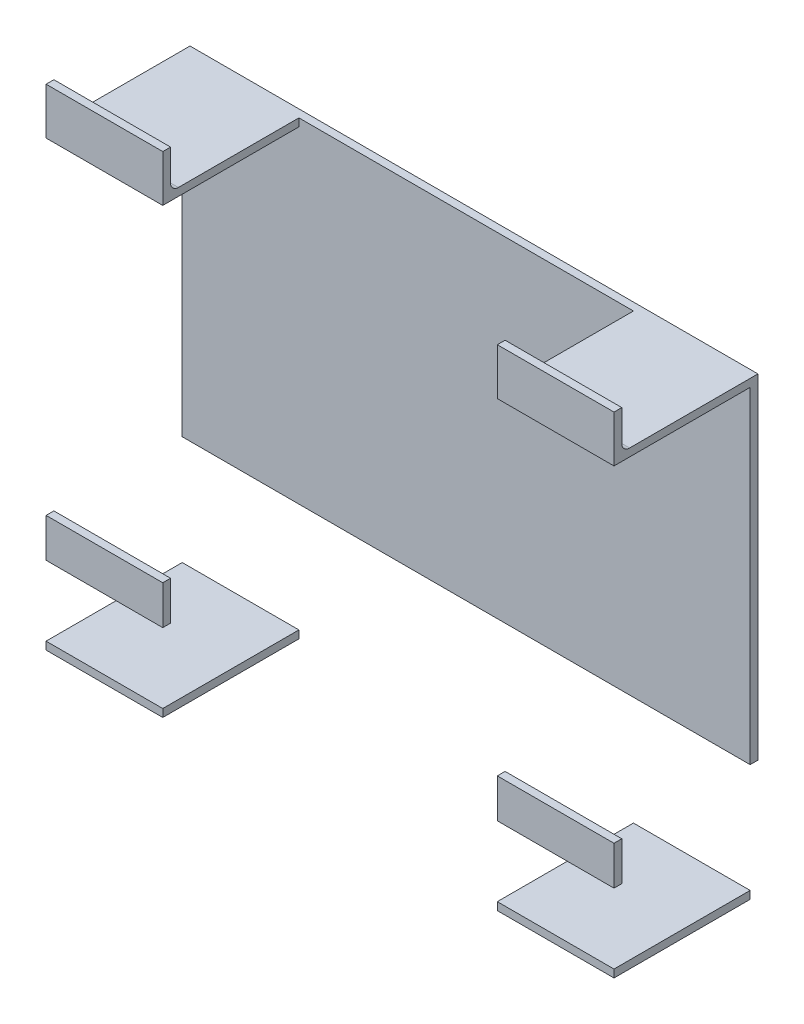
ISO-10303-21;
HEADER;
FILE_DESCRIPTION(('STEP AP214'),'2;1');
FILE_NAME('part.step','',(''),(''),'','','');
FILE_SCHEMA(('AUTOMOTIVE_DESIGN { 1 0 10303 214 1 1 1 1 }'));
ENDSEC;
DATA;
#1=APPLICATION_CONTEXT('core data for automotive mechanical design processes');
#2=APPLICATION_PROTOCOL_DEFINITION('international standard','automotive_design',2000,#1);
#3=PRODUCT_CONTEXT('',#1,'mechanical');
#4=PRODUCT('Part','Part','',(#3));
#5=PRODUCT_RELATED_PRODUCT_CATEGORY('part','',(#4));
#6=PRODUCT_DEFINITION_FORMATION('','',#4);
#7=PRODUCT_DEFINITION_CONTEXT('part definition',#1,'design');
#8=PRODUCT_DEFINITION('design','',#6,#7);
#9=PRODUCT_DEFINITION_SHAPE('','',#8);
#10=(LENGTH_UNIT() NAMED_UNIT(*) SI_UNIT(.MILLI.,.METRE.));
#11=(NAMED_UNIT(*) PLANE_ANGLE_UNIT() SI_UNIT($,.RADIAN.));
#12=(NAMED_UNIT(*) SI_UNIT($,.STERADIAN.) SOLID_ANGLE_UNIT());
#13=UNCERTAINTY_MEASURE_WITH_UNIT(LENGTH_MEASURE(1.E-05),#10,'distance_accuracy_value','');
#14=(GEOMETRIC_REPRESENTATION_CONTEXT(3) GLOBAL_UNCERTAINTY_ASSIGNED_CONTEXT((#13)) GLOBAL_UNIT_ASSIGNED_CONTEXT((#10,
#11,#12)) REPRESENTATION_CONTEXT('',''));
#15=CARTESIAN_POINT('',(0.,0.,0.));
#16=DIRECTION('',(0.,0.,1.));
#17=DIRECTION('',(1.,0.,0.));
#18=AXIS2_PLACEMENT_3D('',#15,#16,#17);
#19=CARTESIAN_POINT('',(43.,-38.,37.));
#20=DIRECTION('',(1.,0.,0.));
#21=DIRECTION('',(0.,0.,-1.));
#22=AXIS2_PLACEMENT_3D('',#19,#20,#21);
#23=PLANE('',#22);
#24=DIRECTION('',(0.,0.,-1.));
#25=VECTOR('',#24,1.);
#26=CARTESIAN_POINT('',(43.,-28.,37.));
#27=LINE('',#26,#25);
#28=CARTESIAN_POINT('',(43.,-28.,37.));
#29=VERTEX_POINT('',#28);
#30=CARTESIAN_POINT('',(43.,-28.,35.));
#31=VERTEX_POINT('',#30);
#32=EDGE_CURVE('E113',#29,#31,#27,.T.);
#33=ORIENTED_EDGE('',*,*,#32,.T.);
#34=DIRECTION('',(0.,1.,0.));
#35=VECTOR('',#34,1.);
#36=CARTESIAN_POINT('',(43.,-38.,35.));
#37=LINE('',#36,#35);
#38=CARTESIAN_POINT('',(43.,-38.,35.));
#39=VERTEX_POINT('',#38);
#40=EDGE_CURVE('E12',#39,#31,#37,.T.);
#41=ORIENTED_EDGE('',*,*,#40,.F.);
#42=DIRECTION('',(0.,0.,-1.));
#43=VECTOR('',#42,1.);
#44=CARTESIAN_POINT('',(43.,-38.,37.));
#45=LINE('',#44,#43);
#46=CARTESIAN_POINT('',(43.,-38.,37.));
#47=VERTEX_POINT('',#46);
#48=EDGE_CURVE('E101',#47,#39,#45,.T.);
#49=ORIENTED_EDGE('',*,*,#48,.F.);
#50=DIRECTION('',(0.,1.,0.));
#51=VECTOR('',#50,1.);
#52=CARTESIAN_POINT('',(43.,-38.,37.));
#53=LINE('',#52,#51);
#54=EDGE_CURVE('E109',#47,#29,#53,.T.);
#55=ORIENTED_EDGE('',*,*,#54,.T.);
#56=EDGE_LOOP('',(#33,#41,#49,#55));
#57=FACE_BOUND('',#56,.T.);
#58=ADVANCED_FACE('F50',(#57),#23,.F.);
#59=CARTESIAN_POINT('',(43.,-38.,35.));
#60=DIRECTION('',(0.,0.,1.));
#61=DIRECTION('',(1.,0.,0.));
#62=AXIS2_PLACEMENT_3D('',#59,#60,#61);
#63=PLANE('',#62);
#64=DIRECTION('',(1.,0.,0.));
#65=VECTOR('',#64,1.);
#66=CARTESIAN_POINT('',(43.,-28.,35.));
#67=LINE('',#66,#65);
#68=CARTESIAN_POINT('',(73.,-28.,35.));
#69=VERTEX_POINT('',#68);
#70=EDGE_CURVE('E105',#31,#69,#67,.T.);
#71=ORIENTED_EDGE('',*,*,#70,.T.);
#72=DIRECTION('',(0.,1.,0.));
#73=VECTOR('',#72,1.);
#74=CARTESIAN_POINT('',(73.,-38.,35.));
#75=LINE('',#74,#73);
#76=CARTESIAN_POINT('',(73.,-38.,35.));
#77=VERTEX_POINT('',#76);
#78=EDGE_CURVE('E58',#77,#69,#75,.T.);
#79=ORIENTED_EDGE('',*,*,#78,.F.);
#80=DIRECTION('',(1.,0.,0.));
#81=VECTOR('',#80,1.);
#82=CARTESIAN_POINT('',(43.,-38.,35.));
#83=LINE('',#82,#81);
#84=EDGE_CURVE('E96',#39,#77,#83,.T.);
#85=ORIENTED_EDGE('',*,*,#84,.F.);
#86=ORIENTED_EDGE('',*,*,#40,.T.);
#87=EDGE_LOOP('',(#71,#79,#85,#86));
#88=FACE_BOUND('',#87,.T.);
#89=ADVANCED_FACE('F104',(#88),#63,.F.);
#90=CARTESIAN_POINT('',(73.,-38.,37.));
#91=DIRECTION('',(-1.,0.,0.));
#92=DIRECTION('',(0.,0.,1.));
#93=AXIS2_PLACEMENT_3D('',#90,#91,#92);
#94=PLANE('',#93);
#95=DIRECTION('',(0.,0.,1.));
#96=VECTOR('',#95,1.);
#97=CARTESIAN_POINT('',(73.,-28.,37.));
#98=LINE('',#97,#96);
#99=CARTESIAN_POINT('',(73.,-28.,37.));
#100=VERTEX_POINT('',#99);
#101=EDGE_CURVE('E83',#69,#100,#98,.T.);
#102=ORIENTED_EDGE('',*,*,#101,.T.);
#103=DIRECTION('',(0.,1.,0.));
#104=VECTOR('',#103,1.);
#105=CARTESIAN_POINT('',(73.,-38.,37.));
#106=LINE('',#105,#104);
#107=CARTESIAN_POINT('',(73.,-38.,37.));
#108=VERTEX_POINT('',#107);
#109=EDGE_CURVE('E106',#108,#100,#106,.T.);
#110=ORIENTED_EDGE('',*,*,#109,.F.);
#111=DIRECTION('',(0.,0.,1.));
#112=VECTOR('',#111,1.);
#113=CARTESIAN_POINT('',(73.,-38.,37.));
#114=LINE('',#113,#112);
#115=EDGE_CURVE('E99',#77,#108,#114,.T.);
#116=ORIENTED_EDGE('',*,*,#115,.F.);
#117=ORIENTED_EDGE('',*,*,#78,.T.);
#118=EDGE_LOOP('',(#102,#110,#116,#117));
#119=FACE_BOUND('',#118,.T.);
#120=ADVANCED_FACE('F107',(#119),#94,.F.);
#121=CARTESIAN_POINT('',(43.,-38.,37.));
#122=DIRECTION('',(0.,0.,-1.));
#123=DIRECTION('',(-1.,0.,0.));
#124=AXIS2_PLACEMENT_3D('',#121,#122,#123);
#125=PLANE('',#124);
#126=DIRECTION('',(-1.,0.,0.));
#127=VECTOR('',#126,1.);
#128=CARTESIAN_POINT('',(43.,-28.,37.));
#129=LINE('',#128,#127);
#130=EDGE_CURVE('E89',#100,#29,#129,.T.);
#131=ORIENTED_EDGE('',*,*,#130,.T.);
#132=ORIENTED_EDGE('',*,*,#54,.F.);
#133=DIRECTION('',(-1.,0.,0.));
#134=VECTOR('',#133,1.);
#135=CARTESIAN_POINT('',(43.,-38.,37.));
#136=LINE('',#135,#134);
#137=EDGE_CURVE('E66',#108,#47,#136,.T.);
#138=ORIENTED_EDGE('',*,*,#137,.F.);
#139=ORIENTED_EDGE('',*,*,#109,.T.);
#140=EDGE_LOOP('',(#131,#132,#138,#139));
#141=FACE_BOUND('',#140,.T.);
#142=ADVANCED_FACE('F120',(#141),#125,.F.);
#143=CARTESIAN_POINT('',(0.,-38.,0.));
#144=DIRECTION('',(0.,-1.,0.));
#145=DIRECTION('',(0.,0.,-1.));
#146=AXIS2_PLACEMENT_3D('',#143,#144,#145);
#147=PLANE('',#146);
#148=ORIENTED_EDGE('',*,*,#48,.T.);
#149=ORIENTED_EDGE('',*,*,#84,.T.);
#150=ORIENTED_EDGE('',*,*,#115,.T.);
#151=ORIENTED_EDGE('',*,*,#137,.T.);
#152=EDGE_LOOP('',(#148,#149,#150,#151));
#153=FACE_BOUND('',#152,.T.);
#154=ADVANCED_FACE('F97',(#153),#147,.T.);
#155=CARTESIAN_POINT('',(0.,-28.,0.));
#156=DIRECTION('',(0.,-1.,0.));
#157=DIRECTION('',(0.,0.,-1.));
#158=AXIS2_PLACEMENT_3D('',#155,#156,#157);
#159=PLANE('',#158);
#160=ORIENTED_EDGE('',*,*,#32,.F.);
#161=ORIENTED_EDGE('',*,*,#130,.F.);
#162=ORIENTED_EDGE('',*,*,#101,.F.);
#163=ORIENTED_EDGE('',*,*,#70,.F.);
#164=EDGE_LOOP('',(#160,#161,#162,#163));
#165=FACE_BOUND('',#164,.T.);
#166=ADVANCED_FACE('F123',(#165),#159,.F.);
#167=CLOSED_SHELL('',(#58,#89,#120,#142,#154,#166));
#168=MANIFOLD_SOLID_BREP('B2',#167);
#169=CARTESIAN_POINT('',(-73.,-38.,37.));
#170=DIRECTION('',(1.,0.,0.));
#171=DIRECTION('',(0.,0.,-1.));
#172=AXIS2_PLACEMENT_3D('',#169,#170,#171);
#173=PLANE('',#172);
#174=DIRECTION('',(0.,0.,-1.));
#175=VECTOR('',#174,1.);
#176=CARTESIAN_POINT('',(-73.,-28.,37.));
#177=LINE('',#176,#175);
#178=CARTESIAN_POINT('',(-73.,-28.,37.));
#179=VERTEX_POINT('',#178);
#180=CARTESIAN_POINT('',(-73.,-28.,35.));
#181=VERTEX_POINT('',#180);
#182=EDGE_CURVE('E247',#179,#181,#177,.T.);
#183=ORIENTED_EDGE('',*,*,#182,.T.);
#184=DIRECTION('',(0.,1.,0.));
#185=VECTOR('',#184,1.);
#186=CARTESIAN_POINT('',(-73.,-38.,35.));
#187=LINE('',#186,#185);
#188=CARTESIAN_POINT('',(-73.,-38.,35.));
#189=VERTEX_POINT('',#188);
#190=EDGE_CURVE('E48',#189,#181,#187,.T.);
#191=ORIENTED_EDGE('',*,*,#190,.F.);
#192=DIRECTION('',(0.,0.,-1.));
#193=VECTOR('',#192,1.);
#194=CARTESIAN_POINT('',(-73.,-38.,37.));
#195=LINE('',#194,#193);
#196=CARTESIAN_POINT('',(-73.,-38.,37.));
#197=VERTEX_POINT('',#196);
#198=EDGE_CURVE('E235',#197,#189,#195,.T.);
#199=ORIENTED_EDGE('',*,*,#198,.F.);
#200=DIRECTION('',(0.,1.,0.));
#201=VECTOR('',#200,1.);
#202=CARTESIAN_POINT('',(-73.,-38.,37.));
#203=LINE('',#202,#201);
#204=EDGE_CURVE('E243',#197,#179,#203,.T.);
#205=ORIENTED_EDGE('',*,*,#204,.T.);
#206=EDGE_LOOP('',(#183,#191,#199,#205));
#207=FACE_BOUND('',#206,.T.);
#208=ADVANCED_FACE('F184',(#207),#173,.F.);
#209=CARTESIAN_POINT('',(-73.,-38.,35.));
#210=DIRECTION('',(0.,0.,1.));
#211=DIRECTION('',(1.,0.,0.));
#212=AXIS2_PLACEMENT_3D('',#209,#210,#211);
#213=PLANE('',#212);
#214=DIRECTION('',(1.,0.,0.));
#215=VECTOR('',#214,1.);
#216=CARTESIAN_POINT('',(-73.,-28.,35.));
#217=LINE('',#216,#215);
#218=CARTESIAN_POINT('',(-43.,-28.,35.));
#219=VERTEX_POINT('',#218);
#220=EDGE_CURVE('E239',#181,#219,#217,.T.);
#221=ORIENTED_EDGE('',*,*,#220,.T.);
#222=DIRECTION('',(0.,1.,0.));
#223=VECTOR('',#222,1.);
#224=CARTESIAN_POINT('',(-43.,-38.,35.));
#225=LINE('',#224,#223);
#226=CARTESIAN_POINT('',(-43.,-38.,35.));
#227=VERTEX_POINT('',#226);
#228=EDGE_CURVE('E192',#227,#219,#225,.T.);
#229=ORIENTED_EDGE('',*,*,#228,.F.);
#230=DIRECTION('',(1.,0.,0.));
#231=VECTOR('',#230,1.);
#232=CARTESIAN_POINT('',(-73.,-38.,35.));
#233=LINE('',#232,#231);
#234=EDGE_CURVE('E230',#189,#227,#233,.T.);
#235=ORIENTED_EDGE('',*,*,#234,.F.);
#236=ORIENTED_EDGE('',*,*,#190,.T.);
#237=EDGE_LOOP('',(#221,#229,#235,#236));
#238=FACE_BOUND('',#237,.T.);
#239=ADVANCED_FACE('F238',(#238),#213,.F.);
#240=CARTESIAN_POINT('',(-43.,-38.,37.));
#241=DIRECTION('',(-1.,0.,0.));
#242=DIRECTION('',(0.,0.,1.));
#243=AXIS2_PLACEMENT_3D('',#240,#241,#242);
#244=PLANE('',#243);
#245=DIRECTION('',(0.,0.,1.));
#246=VECTOR('',#245,1.);
#247=CARTESIAN_POINT('',(-43.,-28.,37.));
#248=LINE('',#247,#246);
#249=CARTESIAN_POINT('',(-43.,-28.,37.));
#250=VERTEX_POINT('',#249);
#251=EDGE_CURVE('E217',#219,#250,#248,.T.);
#252=ORIENTED_EDGE('',*,*,#251,.T.);
#253=DIRECTION('',(0.,1.,0.));
#254=VECTOR('',#253,1.);
#255=CARTESIAN_POINT('',(-43.,-38.,37.));
#256=LINE('',#255,#254);
#257=CARTESIAN_POINT('',(-43.,-38.,37.));
#258=VERTEX_POINT('',#257);
#259=EDGE_CURVE('E240',#258,#250,#256,.T.);
#260=ORIENTED_EDGE('',*,*,#259,.F.);
#261=DIRECTION('',(0.,0.,1.));
#262=VECTOR('',#261,1.);
#263=CARTESIAN_POINT('',(-43.,-38.,37.));
#264=LINE('',#263,#262);
#265=EDGE_CURVE('E233',#227,#258,#264,.T.);
#266=ORIENTED_EDGE('',*,*,#265,.F.);
#267=ORIENTED_EDGE('',*,*,#228,.T.);
#268=EDGE_LOOP('',(#252,#260,#266,#267));
#269=FACE_BOUND('',#268,.T.);
#270=ADVANCED_FACE('F241',(#269),#244,.F.);
#271=CARTESIAN_POINT('',(-73.,-38.,37.));
#272=DIRECTION('',(0.,0.,-1.));
#273=DIRECTION('',(-1.,0.,0.));
#274=AXIS2_PLACEMENT_3D('',#271,#272,#273);
#275=PLANE('',#274);
#276=DIRECTION('',(-1.,0.,0.));
#277=VECTOR('',#276,1.);
#278=CARTESIAN_POINT('',(-73.,-28.,37.));
#279=LINE('',#278,#277);
#280=EDGE_CURVE('E223',#250,#179,#279,.T.);
#281=ORIENTED_EDGE('',*,*,#280,.T.);
#282=ORIENTED_EDGE('',*,*,#204,.F.);
#283=DIRECTION('',(-1.,0.,0.));
#284=VECTOR('',#283,1.);
#285=CARTESIAN_POINT('',(-73.,-38.,37.));
#286=LINE('',#285,#284);
#287=EDGE_CURVE('E200',#258,#197,#286,.T.);
#288=ORIENTED_EDGE('',*,*,#287,.F.);
#289=ORIENTED_EDGE('',*,*,#259,.T.);
#290=EDGE_LOOP('',(#281,#282,#288,#289));
#291=FACE_BOUND('',#290,.T.);
#292=ADVANCED_FACE('F254',(#291),#275,.F.);
#293=CARTESIAN_POINT('',(0.,-38.,0.));
#294=DIRECTION('',(0.,-1.,0.));
#295=DIRECTION('',(0.,0.,-1.));
#296=AXIS2_PLACEMENT_3D('',#293,#294,#295);
#297=PLANE('',#296);
#298=ORIENTED_EDGE('',*,*,#198,.T.);
#299=ORIENTED_EDGE('',*,*,#234,.T.);
#300=ORIENTED_EDGE('',*,*,#265,.T.);
#301=ORIENTED_EDGE('',*,*,#287,.T.);
#302=EDGE_LOOP('',(#298,#299,#300,#301));
#303=FACE_BOUND('',#302,.T.);
#304=ADVANCED_FACE('F231',(#303),#297,.T.);
#305=CARTESIAN_POINT('',(0.,-28.,0.));
#306=DIRECTION('',(0.,-1.,0.));
#307=DIRECTION('',(0.,0.,-1.));
#308=AXIS2_PLACEMENT_3D('',#305,#306,#307);
#309=PLANE('',#308);
#310=ORIENTED_EDGE('',*,*,#182,.F.);
#311=ORIENTED_EDGE('',*,*,#280,.F.);
#312=ORIENTED_EDGE('',*,*,#251,.F.);
#313=ORIENTED_EDGE('',*,*,#220,.F.);
#314=EDGE_LOOP('',(#310,#311,#312,#313));
#315=FACE_BOUND('',#314,.T.);
#316=ADVANCED_FACE('F257',(#315),#309,.F.);
#317=CLOSED_SHELL('',(#208,#239,#270,#292,#304,#316));
#318=MANIFOLD_SOLID_BREP('B6',#317);
#319=CARTESIAN_POINT('',(73.0000000000001,-58.,37.));
#320=DIRECTION('',(-1.,0.,0.));
#321=DIRECTION('',(0.,0.,1.));
#322=AXIS2_PLACEMENT_3D('',#319,#320,#321);
#323=PLANE('',#322);
#324=DIRECTION('',(0.,1.,0.));
#325=VECTOR('',#324,1.);
#326=CARTESIAN_POINT('',(73.0000000000001,-58.,2.));
#327=LINE('',#326,#325);
#328=CARTESIAN_POINT('',(73.0000000000001,-58.,2.));
#329=VERTEX_POINT('',#328);
#330=CARTESIAN_POINT('',(73.0000000000001,-56.,2.));
#331=VERTEX_POINT('',#330);
#332=EDGE_CURVE('E182',#329,#331,#327,.T.);
#333=ORIENTED_EDGE('',*,*,#332,.T.);
#334=DIRECTION('',(0.,0.,-1.));
#335=VECTOR('',#334,1.);
#336=CARTESIAN_POINT('',(73.0000000000001,-56.,37.));
#337=LINE('',#336,#335);
#338=CARTESIAN_POINT('',(73.0000000000001,-56.,37.));
#339=VERTEX_POINT('',#338);
#340=EDGE_CURVE('E389',#339,#331,#337,.T.);
#341=ORIENTED_EDGE('',*,*,#340,.F.);
#342=DIRECTION('',(0.,1.,0.));
#343=VECTOR('',#342,1.);
#344=CARTESIAN_POINT('',(73.0000000000001,-58.,37.));
#345=LINE('',#344,#343);
#346=CARTESIAN_POINT('',(73.0000000000001,-58.,37.));
#347=VERTEX_POINT('',#346);
#348=EDGE_CURVE('E322',#347,#339,#345,.T.);
#349=ORIENTED_EDGE('',*,*,#348,.F.);
#350=DIRECTION('',(0.,0.,-1.));
#351=VECTOR('',#350,1.);
#352=CARTESIAN_POINT('',(73.0000000000001,-58.,37.));
#353=LINE('',#352,#351);
#354=EDGE_CURVE('E362',#347,#329,#353,.T.);
#355=ORIENTED_EDGE('',*,*,#354,.T.);
#356=EDGE_LOOP('',(#333,#341,#349,#355));
#357=FACE_BOUND('',#356,.T.);
#358=ADVANCED_FACE('F318',(#357),#323,.F.);
#359=CARTESIAN_POINT('',(73.0000000000001,-56.,37.));
#360=DIRECTION('',(0.,-1.,0.));
#361=DIRECTION('',(1.,0.,0.));
#362=AXIS2_PLACEMENT_3D('',#359,#360,#361);
#363=PLANE('',#362);
#364=DIRECTION('',(-1.,0.,0.));
#365=VECTOR('',#364,1.);
#366=CARTESIAN_POINT('',(73.0000000000001,-56.,2.));
#367=LINE('',#366,#365);
#368=CARTESIAN_POINT('',(43.,-56.,2.));
#369=VERTEX_POINT('',#368);
#370=EDGE_CURVE('E328',#331,#369,#367,.T.);
#371=ORIENTED_EDGE('',*,*,#370,.T.);
#372=DIRECTION('',(0.,0.,-1.));
#373=VECTOR('',#372,1.);
#374=CARTESIAN_POINT('',(43.,-56.,37.));
#375=LINE('',#374,#373);
#376=CARTESIAN_POINT('',(43.,-56.,37.));
#377=VERTEX_POINT('',#376);
#378=EDGE_CURVE('E376',#377,#369,#375,.T.);
#379=ORIENTED_EDGE('',*,*,#378,.F.);
#380=DIRECTION('',(-1.,0.,0.));
#381=VECTOR('',#380,1.);
#382=CARTESIAN_POINT('',(73.0000000000001,-56.,37.));
#383=LINE('',#382,#381);
#384=EDGE_CURVE('E354',#339,#377,#383,.T.);
#385=ORIENTED_EDGE('',*,*,#384,.F.);
#386=ORIENTED_EDGE('',*,*,#340,.T.);
#387=EDGE_LOOP('',(#371,#379,#385,#386));
#388=FACE_BOUND('',#387,.T.);
#389=ADVANCED_FACE('F392',(#388),#363,.F.);
#390=CARTESIAN_POINT('',(43.,-58.,37.));
#391=DIRECTION('',(-1.,0.,0.));
#392=DIRECTION('',(0.,0.,1.));
#393=AXIS2_PLACEMENT_3D('',#390,#391,#392);
#394=PLANE('',#393);
#395=DIRECTION('',(0.,1.,0.));
#396=VECTOR('',#395,1.);
#397=CARTESIAN_POINT('',(43.,-58.,2.));
#398=LINE('',#397,#396);
#399=CARTESIAN_POINT('',(43.,-58.,2.));
#400=VERTEX_POINT('',#399);
#401=EDGE_CURVE('E378',#400,#369,#398,.T.);
#402=ORIENTED_EDGE('',*,*,#401,.F.);
#403=DIRECTION('',(0.,0.,-1.));
#404=VECTOR('',#403,1.);
#405=CARTESIAN_POINT('',(43.,-58.,37.));
#406=LINE('',#405,#404);
#407=CARTESIAN_POINT('',(43.,-58.,37.));
#408=VERTEX_POINT('',#407);
#409=EDGE_CURVE('E367',#408,#400,#406,.T.);
#410=ORIENTED_EDGE('',*,*,#409,.F.);
#411=DIRECTION('',(0.,1.,0.));
#412=VECTOR('',#411,1.);
#413=CARTESIAN_POINT('',(43.,-58.,37.));
#414=LINE('',#413,#412);
#415=EDGE_CURVE('E387',#408,#377,#414,.T.);
#416=ORIENTED_EDGE('',*,*,#415,.T.);
#417=ORIENTED_EDGE('',*,*,#378,.T.);
#418=EDGE_LOOP('',(#402,#410,#416,#417));
#419=FACE_BOUND('',#418,.T.);
#420=ADVANCED_FACE('F379',(#419),#394,.T.);
#421=CARTESIAN_POINT('',(73.0000000000001,-58.,37.));
#422=DIRECTION('',(0.,-1.,0.));
#423=DIRECTION('',(0.,0.,-1.));
#424=AXIS2_PLACEMENT_3D('',#421,#422,#423);
#425=PLANE('',#424);
#426=DIRECTION('',(-1.,0.,0.));
#427=VECTOR('',#426,1.);
#428=CARTESIAN_POINT('',(73.0000000000001,-58.,2.));
#429=LINE('',#428,#427);
#430=EDGE_CURVE('E371',#329,#400,#429,.T.);
#431=ORIENTED_EDGE('',*,*,#430,.F.);
#432=ORIENTED_EDGE('',*,*,#354,.F.);
#433=DIRECTION('',(-1.,0.,0.));
#434=VECTOR('',#433,1.);
#435=CARTESIAN_POINT('',(73.0000000000001,-58.,37.));
#436=LINE('',#435,#434);
#437=EDGE_CURVE('E373',#347,#408,#436,.T.);
#438=ORIENTED_EDGE('',*,*,#437,.T.);
#439=ORIENTED_EDGE('',*,*,#409,.T.);
#440=EDGE_LOOP('',(#431,#432,#438,#439));
#441=FACE_BOUND('',#440,.T.);
#442=ADVANCED_FACE('F369',(#441),#425,.T.);
#443=CARTESIAN_POINT('',(0.,0.,37.));
#444=DIRECTION('',(0.,0.,1.));
#445=DIRECTION('',(1.,0.,0.));
#446=AXIS2_PLACEMENT_3D('',#443,#444,#445);
#447=PLANE('',#446);
#448=ORIENTED_EDGE('',*,*,#348,.T.);
#449=ORIENTED_EDGE('',*,*,#384,.T.);
#450=ORIENTED_EDGE('',*,*,#415,.F.);
#451=ORIENTED_EDGE('',*,*,#437,.F.);
#452=EDGE_LOOP('',(#448,#449,#450,#451));
#453=FACE_BOUND('',#452,.T.);
#454=ADVANCED_FACE('F320',(#453),#447,.T.);
#455=CARTESIAN_POINT('',(0.,0.,2.));
#456=DIRECTION('',(0.,0.,1.));
#457=DIRECTION('',(1.,0.,0.));
#458=AXIS2_PLACEMENT_3D('',#455,#456,#457);
#459=PLANE('',#458);
#460=ORIENTED_EDGE('',*,*,#332,.F.);
#461=ORIENTED_EDGE('',*,*,#430,.T.);
#462=ORIENTED_EDGE('',*,*,#401,.T.);
#463=ORIENTED_EDGE('',*,*,#370,.F.);
#464=EDGE_LOOP('',(#460,#461,#462,#463));
#465=FACE_BOUND('',#464,.T.);
#466=ADVANCED_FACE('F381',(#465),#459,.F.);
#467=CLOSED_SHELL('',(#358,#389,#420,#442,#454,#466));
#468=MANIFOLD_SOLID_BREP('B42',#467);
#469=CARTESIAN_POINT('',(-73.0000000000001,-58.,37.));
#470=DIRECTION('',(-1.,0.,0.));
#471=DIRECTION('',(0.,0.,1.));
#472=AXIS2_PLACEMENT_3D('',#469,#470,#471);
#473=PLANE('',#472);
#474=DIRECTION('',(0.,1.,0.));
#475=VECTOR('',#474,1.);
#476=CARTESIAN_POINT('',(-73.0000000000001,-58.,2.));
#477=LINE('',#476,#475);
#478=CARTESIAN_POINT('',(-73.0000000000001,-58.,2.));
#479=VERTEX_POINT('',#478);
#480=CARTESIAN_POINT('',(-73.0000000000001,-56.,2.));
#481=VERTEX_POINT('',#480);
#482=EDGE_CURVE('E316',#479,#481,#477,.T.);
#483=ORIENTED_EDGE('',*,*,#482,.F.);
#484=DIRECTION('',(0.,0.,-1.));
#485=VECTOR('',#484,1.);
#486=CARTESIAN_POINT('',(-73.0000000000001,-58.,37.));
#487=LINE('',#486,#485);
#488=CARTESIAN_POINT('',(-73.0000000000001,-58.,37.));
#489=VERTEX_POINT('',#488);
#490=EDGE_CURVE('E497',#489,#479,#487,.T.);
#491=ORIENTED_EDGE('',*,*,#490,.F.);
#492=DIRECTION('',(0.,1.,0.));
#493=VECTOR('',#492,1.);
#494=CARTESIAN_POINT('',(-73.0000000000001,-58.,37.));
#495=LINE('',#494,#493);
#496=CARTESIAN_POINT('',(-73.0000000000001,-56.,37.));
#497=VERTEX_POINT('',#496);
#498=EDGE_CURVE('E455',#489,#497,#495,.T.);
#499=ORIENTED_EDGE('',*,*,#498,.T.);
#500=DIRECTION('',(0.,0.,-1.));
#501=VECTOR('',#500,1.);
#502=CARTESIAN_POINT('',(-73.0000000000001,-56.,37.));
#503=LINE('',#502,#501);
#504=EDGE_CURVE('E470',#497,#481,#503,.T.);
#505=ORIENTED_EDGE('',*,*,#504,.T.);
#506=EDGE_LOOP('',(#483,#491,#499,#505));
#507=FACE_BOUND('',#506,.T.);
#508=ADVANCED_FACE('F451',(#507),#473,.T.);
#509=CARTESIAN_POINT('',(-73.0000000000001,-58.,37.));
#510=DIRECTION('',(0.,1.,0.));
#511=DIRECTION('',(0.,0.,1.));
#512=AXIS2_PLACEMENT_3D('',#509,#510,#511);
#513=PLANE('',#512);
#514=DIRECTION('',(1.,0.,0.));
#515=VECTOR('',#514,1.);
#516=CARTESIAN_POINT('',(-73.0000000000001,-58.,2.));
#517=LINE('',#516,#515);
#518=CARTESIAN_POINT('',(-43.,-58.,2.));
#519=VERTEX_POINT('',#518);
#520=EDGE_CURVE('E500',#479,#519,#517,.T.);
#521=ORIENTED_EDGE('',*,*,#520,.T.);
#522=DIRECTION('',(0.,0.,-1.));
#523=VECTOR('',#522,1.);
#524=CARTESIAN_POINT('',(-43.,-58.,37.));
#525=LINE('',#524,#523);
#526=CARTESIAN_POINT('',(-43.,-58.,37.));
#527=VERTEX_POINT('',#526);
#528=EDGE_CURVE('E503',#527,#519,#525,.T.);
#529=ORIENTED_EDGE('',*,*,#528,.F.);
#530=DIRECTION('',(1.,0.,0.));
#531=VECTOR('',#530,1.);
#532=CARTESIAN_POINT('',(-73.0000000000001,-58.,37.));
#533=LINE('',#532,#531);
#534=EDGE_CURVE('E519',#489,#527,#533,.T.);
#535=ORIENTED_EDGE('',*,*,#534,.F.);
#536=ORIENTED_EDGE('',*,*,#490,.T.);
#537=EDGE_LOOP('',(#521,#529,#535,#536));
#538=FACE_BOUND('',#537,.T.);
#539=ADVANCED_FACE('F502',(#538),#513,.F.);
#540=CARTESIAN_POINT('',(-43.,-58.,37.));
#541=DIRECTION('',(-1.,0.,0.));
#542=DIRECTION('',(0.,0.,1.));
#543=AXIS2_PLACEMENT_3D('',#540,#541,#542);
#544=PLANE('',#543);
#545=DIRECTION('',(0.,1.,0.));
#546=VECTOR('',#545,1.);
#547=CARTESIAN_POINT('',(-43.,-58.,2.));
#548=LINE('',#547,#546);
#549=CARTESIAN_POINT('',(-43.,-56.,2.));
#550=VERTEX_POINT('',#549);
#551=EDGE_CURVE('E506',#519,#550,#548,.T.);
#552=ORIENTED_EDGE('',*,*,#551,.T.);
#553=DIRECTION('',(0.,0.,-1.));
#554=VECTOR('',#553,1.);
#555=CARTESIAN_POINT('',(-43.,-56.,37.));
#556=LINE('',#555,#554);
#557=CARTESIAN_POINT('',(-43.,-56.,37.));
#558=VERTEX_POINT('',#557);
#559=EDGE_CURVE('E512',#558,#550,#556,.T.);
#560=ORIENTED_EDGE('',*,*,#559,.F.);
#561=DIRECTION('',(0.,1.,0.));
#562=VECTOR('',#561,1.);
#563=CARTESIAN_POINT('',(-43.,-58.,37.));
#564=LINE('',#563,#562);
#565=EDGE_CURVE('E487',#527,#558,#564,.T.);
#566=ORIENTED_EDGE('',*,*,#565,.F.);
#567=ORIENTED_EDGE('',*,*,#528,.T.);
#568=EDGE_LOOP('',(#552,#560,#566,#567));
#569=FACE_BOUND('',#568,.T.);
#570=ADVANCED_FACE('F510',(#569),#544,.F.);
#571=CARTESIAN_POINT('',(-73.0000000000001,-56.,37.));
#572=DIRECTION('',(0.,1.,0.));
#573=DIRECTION('',(-1.,0.,0.));
#574=AXIS2_PLACEMENT_3D('',#571,#572,#573);
#575=PLANE('',#574);
#576=DIRECTION('',(1.,0.,0.));
#577=VECTOR('',#576,1.);
#578=CARTESIAN_POINT('',(-73.0000000000001,-56.,2.));
#579=LINE('',#578,#577);
#580=EDGE_CURVE('E461',#481,#550,#579,.T.);
#581=ORIENTED_EDGE('',*,*,#580,.F.);
#582=ORIENTED_EDGE('',*,*,#504,.F.);
#583=DIRECTION('',(1.,0.,0.));
#584=VECTOR('',#583,1.);
#585=CARTESIAN_POINT('',(-73.0000000000001,-56.,37.));
#586=LINE('',#585,#584);
#587=EDGE_CURVE('E521',#497,#558,#586,.T.);
#588=ORIENTED_EDGE('',*,*,#587,.T.);
#589=ORIENTED_EDGE('',*,*,#559,.T.);
#590=EDGE_LOOP('',(#581,#582,#588,#589));
#591=FACE_BOUND('',#590,.T.);
#592=ADVANCED_FACE('F524',(#591),#575,.T.);
#593=CARTESIAN_POINT('',(0.,0.,37.));
#594=DIRECTION('',(0.,0.,-1.));
#595=DIRECTION('',(-1.,0.,0.));
#596=AXIS2_PLACEMENT_3D('',#593,#594,#595);
#597=PLANE('',#596);
#598=ORIENTED_EDGE('',*,*,#498,.F.);
#599=ORIENTED_EDGE('',*,*,#534,.T.);
#600=ORIENTED_EDGE('',*,*,#565,.T.);
#601=ORIENTED_EDGE('',*,*,#587,.F.);
#602=EDGE_LOOP('',(#598,#599,#600,#601));
#603=FACE_BOUND('',#602,.T.);
#604=ADVANCED_FACE('F453',(#603),#597,.F.);
#605=CARTESIAN_POINT('',(0.,0.,2.));
#606=DIRECTION('',(0.,0.,-1.));
#607=DIRECTION('',(-1.,0.,0.));
#608=AXIS2_PLACEMENT_3D('',#605,#606,#607);
#609=PLANE('',#608);
#610=ORIENTED_EDGE('',*,*,#482,.T.);
#611=ORIENTED_EDGE('',*,*,#580,.T.);
#612=ORIENTED_EDGE('',*,*,#551,.F.);
#613=ORIENTED_EDGE('',*,*,#520,.F.);
#614=EDGE_LOOP('',(#610,#611,#612,#613));
#615=FACE_BOUND('',#614,.T.);
#616=ADVANCED_FACE('F514',(#615),#609,.T.);
#617=CLOSED_SHELL('',(#508,#539,#570,#592,#604,#616));
#618=MANIFOLD_SOLID_BREP('B176',#617);
#619=CARTESIAN_POINT('',(0.,58.,2.));
#620=DIRECTION('',(0.,1.,0.));
#621=DIRECTION('',(0.,0.,1.));
#622=AXIS2_PLACEMENT_3D('',#619,#620,#621);
#623=PLANE('',#622);
#624=DIRECTION('',(0.,0.,-1.));
#625=VECTOR('',#624,1.);
#626=CARTESIAN_POINT('',(-73.,58.,2.));
#627=LINE('',#626,#625);
#628=CARTESIAN_POINT('',(-73.,58.,33.));
#629=VERTEX_POINT('',#628);
#630=CARTESIAN_POINT('',(-73.,58.,0.));
#631=VERTEX_POINT('',#630);
#632=EDGE_CURVE('E797',#629,#631,#627,.T.);
#633=ORIENTED_EDGE('',*,*,#632,.F.);
#634=DIRECTION('',(-1.,0.,0.));
#635=VECTOR('',#634,1.);
#636=CARTESIAN_POINT('',(0.,58.,33.));
#637=LINE('',#636,#635);
#638=CARTESIAN_POINT('',(-43.,58.,33.));
#639=VERTEX_POINT('',#638);
#640=EDGE_CURVE('E806',#629,#639,#637,.F.);
#641=ORIENTED_EDGE('',*,*,#640,.T.);
#642=DIRECTION('',(0.,0.,-1.));
#643=VECTOR('',#642,1.);
#644=CARTESIAN_POINT('',(-43.,58.,37.));
#645=LINE('',#644,#643);
#646=CARTESIAN_POINT('',(-43.,58.,2.));
#647=VERTEX_POINT('',#646);
#648=EDGE_CURVE('E760',#639,#647,#645,.T.);
#649=ORIENTED_EDGE('',*,*,#648,.T.);
#650=DIRECTION('',(1.,0.,0.));
#651=VECTOR('',#650,1.);
#652=CARTESIAN_POINT('',(0.,58.,2.));
#653=LINE('',#652,#651);
#654=CARTESIAN_POINT('',(43.,58.,2.));
#655=VERTEX_POINT('',#654);
#656=EDGE_CURVE('E774',#647,#655,#653,.T.);
#657=ORIENTED_EDGE('',*,*,#656,.T.);
#658=DIRECTION('',(0.,0.,-1.));
#659=VECTOR('',#658,1.);
#660=CARTESIAN_POINT('',(43.,58.,37.));
#661=LINE('',#660,#659);
#662=CARTESIAN_POINT('',(43.,58.,33.));
#663=VERTEX_POINT('',#662);
#664=EDGE_CURVE('E739',#663,#655,#661,.T.);
#665=ORIENTED_EDGE('',*,*,#664,.F.);
#666=DIRECTION('',(-1.,0.,0.));
#667=VECTOR('',#666,1.);
#668=CARTESIAN_POINT('',(0.,58.,33.));
#669=LINE('',#668,#667);
#670=CARTESIAN_POINT('',(73.,58.,33.));
#671=VERTEX_POINT('',#670);
#672=EDGE_CURVE('E804',#663,#671,#669,.F.);
#673=ORIENTED_EDGE('',*,*,#672,.T.);
#674=DIRECTION('',(0.,0.,-1.));
#675=VECTOR('',#674,1.);
#676=CARTESIAN_POINT('',(73.,58.,2.));
#677=LINE('',#676,#675);
#678=CARTESIAN_POINT('',(73.,58.,0.));
#679=VERTEX_POINT('',#678);
#680=EDGE_CURVE('E799',#671,#679,#677,.T.);
#681=ORIENTED_EDGE('',*,*,#680,.T.);
#682=DIRECTION('',(1.,0.,0.));
#683=VECTOR('',#682,1.);
#684=CARTESIAN_POINT('',(0.,58.,0.));
#685=LINE('',#684,#683);
#686=EDGE_CURVE('E786',#631,#679,#685,.T.);
#687=ORIENTED_EDGE('',*,*,#686,.F.);
#688=EDGE_LOOP('',(#633,#641,#649,#657,#665,#673,#681,#687));
#689=FACE_BOUND('',#688,.T.);
#690=ADVANCED_FACE('F575',(#689),#623,.T.);
#691=CARTESIAN_POINT('',(0.,0.,2.));
#692=DIRECTION('',(0.,0.,1.));
#693=DIRECTION('',(1.,0.,0.));
#694=AXIS2_PLACEMENT_3D('',#691,#692,#693);
#695=PLANE('',#694);
#696=DIRECTION('',(-1.,0.,0.));
#697=VECTOR('',#696,1.);
#698=CARTESIAN_POINT('',(73.,56.,2.));
#699=LINE('',#698,#697);
#700=CARTESIAN_POINT('',(73.,56.,2.));
#701=VERTEX_POINT('',#700);
#702=CARTESIAN_POINT('',(43.,56.,2.));
#703=VERTEX_POINT('',#702);
#704=EDGE_CURVE('E745',#701,#703,#699,.T.);
#705=ORIENTED_EDGE('',*,*,#704,.T.);
#706=DIRECTION('',(0.,-1.,0.));
#707=VECTOR('',#706,1.);
#708=CARTESIAN_POINT('',(43.,58.,2.));
#709=LINE('',#708,#707);
#710=EDGE_CURVE('E743',#655,#703,#709,.T.);
#711=ORIENTED_EDGE('',*,*,#710,.F.);
#712=ORIENTED_EDGE('',*,*,#656,.F.);
#713=DIRECTION('',(0.,-1.,0.));
#714=VECTOR('',#713,1.);
#715=CARTESIAN_POINT('',(-43.,58.,2.));
#716=LINE('',#715,#714);
#717=CARTESIAN_POINT('',(-43.,56.,2.));
#718=VERTEX_POINT('',#717);
#719=EDGE_CURVE('E755',#647,#718,#716,.T.);
#720=ORIENTED_EDGE('',*,*,#719,.T.);
#721=DIRECTION('',(1.,0.,0.));
#722=VECTOR('',#721,1.);
#723=CARTESIAN_POINT('',(-73.,56.,2.));
#724=LINE('',#723,#722);
#725=CARTESIAN_POINT('',(-73.,56.,2.));
#726=VERTEX_POINT('',#725);
#727=EDGE_CURVE('E747',#726,#718,#724,.T.);
#728=ORIENTED_EDGE('',*,*,#727,.F.);
#729=DIRECTION('',(0.,-1.,0.));
#730=VECTOR('',#729,1.);
#731=CARTESIAN_POINT('',(-73.,0.,2.));
#732=LINE('',#731,#730);
#733=CARTESIAN_POINT('',(-73.,-28.,2.));
#734=VERTEX_POINT('',#733);
#735=EDGE_CURVE('E778',#726,#734,#732,.T.);
#736=ORIENTED_EDGE('',*,*,#735,.T.);
#737=DIRECTION('',(1.,0.,0.));
#738=VECTOR('',#737,1.);
#739=CARTESIAN_POINT('',(0.,-28.,2.));
#740=LINE('',#739,#738);
#741=CARTESIAN_POINT('',(73.,-28.,2.));
#742=VERTEX_POINT('',#741);
#743=EDGE_CURVE('E780',#734,#742,#740,.T.);
#744=ORIENTED_EDGE('',*,*,#743,.T.);
#745=DIRECTION('',(0.,-1.,0.));
#746=VECTOR('',#745,1.);
#747=CARTESIAN_POINT('',(73.,0.,2.));
#748=LINE('',#747,#746);
#749=EDGE_CURVE('E772',#701,#742,#748,.T.);
#750=ORIENTED_EDGE('',*,*,#749,.F.);
#751=EDGE_LOOP('',(#705,#711,#712,#720,#728,#736,#744,#750));
#752=FACE_BOUND('',#751,.T.);
#753=ADVANCED_FACE('F827',(#752),#695,.T.);
#754=CARTESIAN_POINT('',(73.,0.,2.));
#755=DIRECTION('',(1.,0.,0.));
#756=DIRECTION('',(0.,1.,0.));
#757=AXIS2_PLACEMENT_3D('',#754,#755,#756);
#758=PLANE('',#757);
#759=DIRECTION('',(0.,-1.,0.));
#760=VECTOR('',#759,1.);
#761=CARTESIAN_POINT('',(73.,0.,0.));
#762=LINE('',#761,#760);
#763=CARTESIAN_POINT('',(73.,-28.,0.));
#764=VERTEX_POINT('',#763);
#765=EDGE_CURVE('E771',#679,#764,#762,.T.);
#766=ORIENTED_EDGE('',*,*,#765,.F.);
#767=ORIENTED_EDGE('',*,*,#680,.F.);
#768=CARTESIAN_POINT('',(73.,60.,33.));
#769=DIRECTION('',(1.,0.,0.));
#770=DIRECTION('',(0.,1.,0.));
#771=AXIS2_PLACEMENT_3D('',#768,#769,#770);
#772=CIRCLE('',#771,2.);
#773=CARTESIAN_POINT('',(73.,60.,35.));
#774=VERTEX_POINT('',#773);
#775=EDGE_CURVE('E449',#671,#774,#772,.F.);
#776=ORIENTED_EDGE('',*,*,#775,.T.);
#777=DIRECTION('',(0.,-1.,0.));
#778=VECTOR('',#777,1.);
#779=CARTESIAN_POINT('',(73.,68.,35.));
#780=LINE('',#779,#778);
#781=CARTESIAN_POINT('',(73.,68.,35.));
#782=VERTEX_POINT('',#781);
#783=EDGE_CURVE('E721',#782,#774,#780,.T.);
#784=ORIENTED_EDGE('',*,*,#783,.F.);
#785=DIRECTION('',(0.,0.,-1.));
#786=VECTOR('',#785,1.);
#787=CARTESIAN_POINT('',(73.,68.,37.));
#788=LINE('',#787,#786);
#789=CARTESIAN_POINT('',(73.,68.,37.));
#790=VERTEX_POINT('',#789);
#791=EDGE_CURVE('E709',#790,#782,#788,.T.);
#792=ORIENTED_EDGE('',*,*,#791,.F.);
#793=DIRECTION('',(0.,-1.,0.));
#794=VECTOR('',#793,1.);
#795=CARTESIAN_POINT('',(73.,58.,37.));
#796=LINE('',#795,#794);
#797=CARTESIAN_POINT('',(73.,56.,37.));
#798=VERTEX_POINT('',#797);
#799=EDGE_CURVE('E706',#790,#798,#796,.T.);
#800=ORIENTED_EDGE('',*,*,#799,.T.);
#801=DIRECTION('',(0.,0.,-1.));
#802=VECTOR('',#801,1.);
#803=CARTESIAN_POINT('',(73.,56.,37.));
#804=LINE('',#803,#802);
#805=EDGE_CURVE('E700',#798,#701,#804,.T.);
#806=ORIENTED_EDGE('',*,*,#805,.T.);
#807=ORIENTED_EDGE('',*,*,#749,.T.);
#808=DIRECTION('',(0.,0.,-1.));
#809=VECTOR('',#808,1.);
#810=CARTESIAN_POINT('',(73.,-28.,2.));
#811=LINE('',#810,#809);
#812=EDGE_CURVE('E783',#742,#764,#811,.T.);
#813=ORIENTED_EDGE('',*,*,#812,.T.);
#814=EDGE_LOOP('',(#766,#767,#776,#784,#792,#800,#806,#807,#813));
#815=FACE_BOUND('',#814,.T.);
#816=ADVANCED_FACE('F821',(#815),#758,.T.);
#817=CARTESIAN_POINT('',(-73.,0.,2.));
#818=DIRECTION('',(1.,0.,0.));
#819=DIRECTION('',(0.,1.,0.));
#820=AXIS2_PLACEMENT_3D('',#817,#818,#819);
#821=PLANE('',#820);
#822=DIRECTION('',(0.,-1.,0.));
#823=VECTOR('',#822,1.);
#824=CARTESIAN_POINT('',(-73.,0.,0.));
#825=LINE('',#824,#823);
#826=CARTESIAN_POINT('',(-73.,-28.,0.));
#827=VERTEX_POINT('',#826);
#828=EDGE_CURVE('E789',#631,#827,#825,.T.);
#829=ORIENTED_EDGE('',*,*,#828,.T.);
#830=DIRECTION('',(0.,0.,-1.));
#831=VECTOR('',#830,1.);
#832=CARTESIAN_POINT('',(-73.,-28.,2.));
#833=LINE('',#832,#831);
#834=EDGE_CURVE('E794',#734,#827,#833,.T.);
#835=ORIENTED_EDGE('',*,*,#834,.F.);
#836=ORIENTED_EDGE('',*,*,#735,.F.);
#837=DIRECTION('',(0.,0.,-1.));
#838=VECTOR('',#837,1.);
#839=CARTESIAN_POINT('',(-73.,56.,37.));
#840=LINE('',#839,#838);
#841=CARTESIAN_POINT('',(-73.,56.,37.));
#842=VERTEX_POINT('',#841);
#843=EDGE_CURVE('E768',#842,#726,#840,.T.);
#844=ORIENTED_EDGE('',*,*,#843,.F.);
#845=DIRECTION('',(0.,-1.,0.));
#846=VECTOR('',#845,1.);
#847=CARTESIAN_POINT('',(-73.,58.,37.));
#848=LINE('',#847,#846);
#849=CARTESIAN_POINT('',(-73.,68.,37.));
#850=VERTEX_POINT('',#849);
#851=EDGE_CURVE('E751',#850,#842,#848,.T.);
#852=ORIENTED_EDGE('',*,*,#851,.F.);
#853=DIRECTION('',(0.,0.,1.));
#854=VECTOR('',#853,1.);
#855=CARTESIAN_POINT('',(-73.,68.,37.));
#856=LINE('',#855,#854);
#857=CARTESIAN_POINT('',(-73.,68.,35.));
#858=VERTEX_POINT('',#857);
#859=EDGE_CURVE('E723',#858,#850,#856,.T.);
#860=ORIENTED_EDGE('',*,*,#859,.F.);
#861=DIRECTION('',(0.,-1.,0.));
#862=VECTOR('',#861,1.);
#863=CARTESIAN_POINT('',(-73.,68.,35.));
#864=LINE('',#863,#862);
#865=CARTESIAN_POINT('',(-73.,60.,35.));
#866=VERTEX_POINT('',#865);
#867=EDGE_CURVE('E733',#858,#866,#864,.T.);
#868=ORIENTED_EDGE('',*,*,#867,.T.);
#869=CARTESIAN_POINT('',(-73.,60.,33.));
#870=DIRECTION('',(1.,0.,0.));
#871=DIRECTION('',(0.,1.,0.));
#872=AXIS2_PLACEMENT_3D('',#869,#870,#871);
#873=CIRCLE('',#872,2.);
#874=EDGE_CURVE('E810',#866,#629,#873,.T.);
#875=ORIENTED_EDGE('',*,*,#874,.T.);
#876=ORIENTED_EDGE('',*,*,#632,.T.);
#877=EDGE_LOOP('',(#829,#835,#836,#844,#852,#860,#868,#875,#876));
#878=FACE_BOUND('',#877,.T.);
#879=ADVANCED_FACE('F865',(#878),#821,.F.);
#880=CARTESIAN_POINT('',(0.,-28.,2.));
#881=DIRECTION('',(0.,1.,0.));
#882=DIRECTION('',(0.,0.,1.));
#883=AXIS2_PLACEMENT_3D('',#880,#881,#882);
#884=PLANE('',#883);
#885=DIRECTION('',(1.,0.,0.));
#886=VECTOR('',#885,1.);
#887=CARTESIAN_POINT('',(0.,-28.,0.));
#888=LINE('',#887,#886);
#889=EDGE_CURVE('E775',#827,#764,#888,.T.);
#890=ORIENTED_EDGE('',*,*,#889,.T.);
#891=ORIENTED_EDGE('',*,*,#812,.F.);
#892=ORIENTED_EDGE('',*,*,#743,.F.);
#893=ORIENTED_EDGE('',*,*,#834,.T.);
#894=EDGE_LOOP('',(#890,#891,#892,#893));
#895=FACE_BOUND('',#894,.T.);
#896=ADVANCED_FACE('F833',(#895),#884,.F.);
#897=CARTESIAN_POINT('',(0.,0.,0.));
#898=DIRECTION('',(0.,0.,1.));
#899=DIRECTION('',(1.,0.,0.));
#900=AXIS2_PLACEMENT_3D('',#897,#898,#899);
#901=PLANE('',#900);
#902=ORIENTED_EDGE('',*,*,#765,.T.);
#903=ORIENTED_EDGE('',*,*,#889,.F.);
#904=ORIENTED_EDGE('',*,*,#828,.F.);
#905=ORIENTED_EDGE('',*,*,#686,.T.);
#906=EDGE_LOOP('',(#902,#903,#904,#905));
#907=FACE_BOUND('',#906,.T.);
#908=ADVANCED_FACE('F838',(#907),#901,.F.);
#909=CARTESIAN_POINT('',(-73.,56.,37.));
#910=DIRECTION('',(0.,1.,0.));
#911=DIRECTION('',(-1.,0.,0.));
#912=AXIS2_PLACEMENT_3D('',#909,#910,#911);
#913=PLANE('',#912);
#914=ORIENTED_EDGE('',*,*,#727,.T.);
#915=DIRECTION('',(0.,0.,-1.));
#916=VECTOR('',#915,1.);
#917=CARTESIAN_POINT('',(-43.,56.,37.));
#918=LINE('',#917,#916);
#919=CARTESIAN_POINT('',(-43.,56.,37.));
#920=VERTEX_POINT('',#919);
#921=EDGE_CURVE('E765',#920,#718,#918,.T.);
#922=ORIENTED_EDGE('',*,*,#921,.F.);
#923=DIRECTION('',(1.,0.,0.));
#924=VECTOR('',#923,1.);
#925=CARTESIAN_POINT('',(-73.,56.,37.));
#926=LINE('',#925,#924);
#927=EDGE_CURVE('E754',#842,#920,#926,.T.);
#928=ORIENTED_EDGE('',*,*,#927,.F.);
#929=ORIENTED_EDGE('',*,*,#843,.T.);
#930=EDGE_LOOP('',(#914,#922,#928,#929));
#931=FACE_BOUND('',#930,.T.);
#932=ADVANCED_FACE('F864',(#931),#913,.F.);
#933=CARTESIAN_POINT('',(-43.,58.,37.));
#934=DIRECTION('',(1.,0.,0.));
#935=DIRECTION('',(0.,0.,-1.));
#936=AXIS2_PLACEMENT_3D('',#933,#934,#935);
#937=PLANE('',#936);
#938=ORIENTED_EDGE('',*,*,#719,.F.);
#939=ORIENTED_EDGE('',*,*,#648,.F.);
#940=CARTESIAN_POINT('',(-43.,60.,33.));
#941=DIRECTION('',(1.,0.,0.));
#942=DIRECTION('',(0.,0.,-1.));
#943=AXIS2_PLACEMENT_3D('',#940,#941,#942);
#944=CIRCLE('',#943,2.);
#945=CARTESIAN_POINT('',(-43.,60.,35.));
#946=VERTEX_POINT('',#945);
#947=EDGE_CURVE('E812',#639,#946,#944,.F.);
#948=ORIENTED_EDGE('',*,*,#947,.T.);
#949=DIRECTION('',(0.,-1.,0.));
#950=VECTOR('',#949,1.);
#951=CARTESIAN_POINT('',(-43.,68.,35.));
#952=LINE('',#951,#950);
#953=CARTESIAN_POINT('',(-43.,68.,35.));
#954=VERTEX_POINT('',#953);
#955=EDGE_CURVE('E736',#954,#946,#952,.T.);
#956=ORIENTED_EDGE('',*,*,#955,.F.);
#957=DIRECTION('',(0.,0.,-1.));
#958=VECTOR('',#957,1.);
#959=CARTESIAN_POINT('',(-43.,68.,37.));
#960=LINE('',#959,#958);
#961=CARTESIAN_POINT('',(-43.,68.,37.));
#962=VERTEX_POINT('',#961);
#963=EDGE_CURVE('E729',#962,#954,#960,.T.);
#964=ORIENTED_EDGE('',*,*,#963,.F.);
#965=DIRECTION('',(0.,-1.,0.));
#966=VECTOR('',#965,1.);
#967=CARTESIAN_POINT('',(-43.,58.,37.));
#968=LINE('',#967,#966);
#969=EDGE_CURVE('E757',#962,#920,#968,.T.);
#970=ORIENTED_EDGE('',*,*,#969,.T.);
#971=ORIENTED_EDGE('',*,*,#921,.T.);
#972=EDGE_LOOP('',(#938,#939,#948,#956,#964,#970,#971));
#973=FACE_BOUND('',#972,.T.);
#974=ADVANCED_FACE('F849',(#973),#937,.T.);
#975=CARTESIAN_POINT('',(0.,0.,37.));
#976=DIRECTION('',(0.,0.,1.));
#977=DIRECTION('',(1.,0.,0.));
#978=AXIS2_PLACEMENT_3D('',#975,#976,#977);
#979=PLANE('',#978);
#980=ORIENTED_EDGE('',*,*,#851,.T.);
#981=ORIENTED_EDGE('',*,*,#927,.T.);
#982=ORIENTED_EDGE('',*,*,#969,.F.);
#983=DIRECTION('',(1.,0.,0.));
#984=VECTOR('',#983,1.);
#985=CARTESIAN_POINT('',(-73.,68.,37.));
#986=LINE('',#985,#984);
#987=EDGE_CURVE('E726',#850,#962,#986,.T.);
#988=ORIENTED_EDGE('',*,*,#987,.F.);
#989=EDGE_LOOP('',(#980,#981,#982,#988));
#990=FACE_BOUND('',#989,.T.);
#991=ADVANCED_FACE('F861',(#990),#979,.T.);
#992=CARTESIAN_POINT('',(43.,58.,37.));
#993=DIRECTION('',(1.,0.,0.));
#994=DIRECTION('',(0.,0.,-1.));
#995=AXIS2_PLACEMENT_3D('',#992,#993,#994);
#996=PLANE('',#995);
#997=ORIENTED_EDGE('',*,*,#710,.T.);
#998=DIRECTION('',(0.,0.,-1.));
#999=VECTOR('',#998,1.);
#1000=CARTESIAN_POINT('',(43.,56.,37.));
#1001=LINE('',#1000,#999);
#1002=CARTESIAN_POINT('',(43.,56.,37.));
#1003=VERTEX_POINT('',#1002);
#1004=EDGE_CURVE('E695',#1003,#703,#1001,.T.);
#1005=ORIENTED_EDGE('',*,*,#1004,.F.);
#1006=DIRECTION('',(0.,-1.,0.));
#1007=VECTOR('',#1006,1.);
#1008=CARTESIAN_POINT('',(43.,58.,37.));
#1009=LINE('',#1008,#1007);
#1010=CARTESIAN_POINT('',(43.,68.,37.));
#1011=VERTEX_POINT('',#1010);
#1012=EDGE_CURVE('E688',#1011,#1003,#1009,.T.);
#1013=ORIENTED_EDGE('',*,*,#1012,.F.);
#1014=DIRECTION('',(0.,0.,1.));
#1015=VECTOR('',#1014,1.);
#1016=CARTESIAN_POINT('',(43.,68.,37.));
#1017=LINE('',#1016,#1015);
#1018=CARTESIAN_POINT('',(43.,68.,35.));
#1019=VERTEX_POINT('',#1018);
#1020=EDGE_CURVE('E694',#1019,#1011,#1017,.T.);
#1021=ORIENTED_EDGE('',*,*,#1020,.F.);
#1022=DIRECTION('',(0.,-1.,0.));
#1023=VECTOR('',#1022,1.);
#1024=CARTESIAN_POINT('',(43.,68.,35.));
#1025=LINE('',#1024,#1023);
#1026=CARTESIAN_POINT('',(43.,60.,35.));
#1027=VERTEX_POINT('',#1026);
#1028=EDGE_CURVE('E719',#1019,#1027,#1025,.T.);
#1029=ORIENTED_EDGE('',*,*,#1028,.T.);
#1030=CARTESIAN_POINT('',(43.,60.,33.));
#1031=DIRECTION('',(1.,0.,0.));
#1032=DIRECTION('',(0.,0.,-1.));
#1033=AXIS2_PLACEMENT_3D('',#1030,#1031,#1032);
#1034=CIRCLE('',#1033,2.);
#1035=EDGE_CURVE('E583',#1027,#663,#1034,.T.);
#1036=ORIENTED_EDGE('',*,*,#1035,.T.);
#1037=ORIENTED_EDGE('',*,*,#664,.T.);
#1038=EDGE_LOOP('',(#997,#1005,#1013,#1021,#1029,#1036,#1037));
#1039=FACE_BOUND('',#1038,.T.);
#1040=ADVANCED_FACE('F691',(#1039),#996,.F.);
#1041=CARTESIAN_POINT('',(73.,56.,37.));
#1042=DIRECTION('',(0.,-1.,0.));
#1043=DIRECTION('',(1.,0.,0.));
#1044=AXIS2_PLACEMENT_3D('',#1041,#1042,#1043);
#1045=PLANE('',#1044);
#1046=ORIENTED_EDGE('',*,*,#704,.F.);
#1047=ORIENTED_EDGE('',*,*,#805,.F.);
#1048=DIRECTION('',(-1.,0.,0.));
#1049=VECTOR('',#1048,1.);
#1050=CARTESIAN_POINT('',(73.,56.,37.));
#1051=LINE('',#1050,#1049);
#1052=EDGE_CURVE('E699',#798,#1003,#1051,.T.);
#1053=ORIENTED_EDGE('',*,*,#1052,.T.);
#1054=ORIENTED_EDGE('',*,*,#1004,.T.);
#1055=EDGE_LOOP('',(#1046,#1047,#1053,#1054));
#1056=FACE_BOUND('',#1055,.T.);
#1057=ADVANCED_FACE('F825',(#1056),#1045,.T.);
#1058=CARTESIAN_POINT('',(0.,0.,37.));
#1059=DIRECTION('',(0.,0.,-1.));
#1060=DIRECTION('',(-1.,0.,0.));
#1061=AXIS2_PLACEMENT_3D('',#1058,#1059,#1060);
#1062=PLANE('',#1061);
#1063=ORIENTED_EDGE('',*,*,#799,.F.);
#1064=DIRECTION('',(1.,0.,0.));
#1065=VECTOR('',#1064,1.);
#1066=CARTESIAN_POINT('',(43.,68.,37.));
#1067=LINE('',#1066,#1065);
#1068=EDGE_CURVE('E703',#1011,#790,#1067,.T.);
#1069=ORIENTED_EDGE('',*,*,#1068,.F.);
#1070=ORIENTED_EDGE('',*,*,#1012,.T.);
#1071=ORIENTED_EDGE('',*,*,#1052,.F.);
#1072=EDGE_LOOP('',(#1063,#1069,#1070,#1071));
#1073=FACE_BOUND('',#1072,.T.);
#1074=ADVANCED_FACE('F704',(#1073),#1062,.F.);
#1075=CARTESIAN_POINT('',(-73.,68.,35.));
#1076=DIRECTION('',(0.,0.,1.));
#1077=DIRECTION('',(1.,0.,0.));
#1078=AXIS2_PLACEMENT_3D('',#1075,#1076,#1077);
#1079=PLANE('',#1078);
#1080=ORIENTED_EDGE('',*,*,#955,.T.);
#1081=DIRECTION('',(-1.,0.,0.));
#1082=VECTOR('',#1081,1.);
#1083=CARTESIAN_POINT('',(-73.,60.,35.));
#1084=LINE('',#1083,#1082);
#1085=EDGE_CURVE('E801',#946,#866,#1084,.T.);
#1086=ORIENTED_EDGE('',*,*,#1085,.T.);
#1087=ORIENTED_EDGE('',*,*,#867,.F.);
#1088=DIRECTION('',(-1.,0.,0.));
#1089=VECTOR('',#1088,1.);
#1090=CARTESIAN_POINT('',(-73.,68.,35.));
#1091=LINE('',#1090,#1089);
#1092=EDGE_CURVE('E731',#954,#858,#1091,.T.);
#1093=ORIENTED_EDGE('',*,*,#1092,.F.);
#1094=EDGE_LOOP('',(#1080,#1086,#1087,#1093));
#1095=FACE_BOUND('',#1094,.T.);
#1096=ADVANCED_FACE('F853',(#1095),#1079,.F.);
#1097=CARTESIAN_POINT('',(0.,68.,0.));
#1098=DIRECTION('',(0.,-1.,0.));
#1099=DIRECTION('',(0.,0.,-1.));
#1100=AXIS2_PLACEMENT_3D('',#1097,#1098,#1099);
#1101=PLANE('',#1100);
#1102=ORIENTED_EDGE('',*,*,#859,.T.);
#1103=ORIENTED_EDGE('',*,*,#987,.T.);
#1104=ORIENTED_EDGE('',*,*,#963,.T.);
#1105=ORIENTED_EDGE('',*,*,#1092,.T.);
#1106=EDGE_LOOP('',(#1102,#1103,#1104,#1105));
#1107=FACE_BOUND('',#1106,.T.);
#1108=ADVANCED_FACE('F857',(#1107),#1101,.F.);
#1109=CARTESIAN_POINT('',(43.,68.,35.));
#1110=DIRECTION('',(0.,0.,1.));
#1111=DIRECTION('',(1.,0.,0.));
#1112=AXIS2_PLACEMENT_3D('',#1109,#1110,#1111);
#1113=PLANE('',#1112);
#1114=ORIENTED_EDGE('',*,*,#783,.T.);
#1115=DIRECTION('',(-1.,0.,0.));
#1116=VECTOR('',#1115,1.);
#1117=CARTESIAN_POINT('',(43.,60.,35.));
#1118=LINE('',#1117,#1116);
#1119=EDGE_CURVE('E808',#774,#1027,#1118,.T.);
#1120=ORIENTED_EDGE('',*,*,#1119,.T.);
#1121=ORIENTED_EDGE('',*,*,#1028,.F.);
#1122=DIRECTION('',(-1.,0.,0.));
#1123=VECTOR('',#1122,1.);
#1124=CARTESIAN_POINT('',(43.,68.,35.));
#1125=LINE('',#1124,#1123);
#1126=EDGE_CURVE('E713',#782,#1019,#1125,.T.);
#1127=ORIENTED_EDGE('',*,*,#1126,.F.);
#1128=EDGE_LOOP('',(#1114,#1120,#1121,#1127));
#1129=FACE_BOUND('',#1128,.T.);
#1130=ADVANCED_FACE('F819',(#1129),#1113,.F.);
#1131=CARTESIAN_POINT('',(0.,68.,0.));
#1132=DIRECTION('',(0.,-1.,0.));
#1133=DIRECTION('',(0.,0.,-1.));
#1134=AXIS2_PLACEMENT_3D('',#1131,#1132,#1133);
#1135=PLANE('',#1134);
#1136=ORIENTED_EDGE('',*,*,#1020,.T.);
#1137=ORIENTED_EDGE('',*,*,#1068,.T.);
#1138=ORIENTED_EDGE('',*,*,#791,.T.);
#1139=ORIENTED_EDGE('',*,*,#1126,.T.);
#1140=EDGE_LOOP('',(#1136,#1137,#1138,#1139));
#1141=FACE_BOUND('',#1140,.T.);
#1142=ADVANCED_FACE('F711',(#1141),#1135,.F.);
#1143=CARTESIAN_POINT('',(-73.,60.,33.));
#1144=DIRECTION('',(-1.,0.,0.));
#1145=DIRECTION('',(0.,0.,1.));
#1146=AXIS2_PLACEMENT_3D('',#1143,#1144,#1145);
#1147=CYLINDRICAL_SURFACE('',#1146,2.);
#1148=ORIENTED_EDGE('',*,*,#947,.F.);
#1149=ORIENTED_EDGE('',*,*,#640,.F.);
#1150=ORIENTED_EDGE('',*,*,#874,.F.);
#1151=ORIENTED_EDGE('',*,*,#1085,.F.);
#1152=EDGE_LOOP('',(#1148,#1149,#1150,#1151));
#1153=FACE_BOUND('',#1152,.T.);
#1154=ADVANCED_FACE('F844',(#1153),#1147,.F.);
#1155=CARTESIAN_POINT('',(43.,60.,33.));
#1156=DIRECTION('',(-1.,0.,0.));
#1157=DIRECTION('',(0.,0.,1.));
#1158=AXIS2_PLACEMENT_3D('',#1155,#1156,#1157);
#1159=CYLINDRICAL_SURFACE('',#1158,2.);
#1160=ORIENTED_EDGE('',*,*,#775,.F.);
#1161=ORIENTED_EDGE('',*,*,#672,.F.);
#1162=ORIENTED_EDGE('',*,*,#1035,.F.);
#1163=ORIENTED_EDGE('',*,*,#1119,.F.);
#1164=EDGE_LOOP('',(#1160,#1161,#1162,#1163));
#1165=FACE_BOUND('',#1164,.T.);
#1166=ADVANCED_FACE('F577',(#1165),#1159,.F.);
#1167=CLOSED_SHELL('',(#690,#753,#816,#879,#896,#908,#932,#974,#991,#1040,#1057,#1074,#1096,
#1108,#1130,#1142,#1154,#1166));
#1168=MANIFOLD_SOLID_BREP('B310',#1167);
#1169=ADVANCED_BREP_SHAPE_REPRESENTATION('',(#18,#168,#318,#468,#618,#1168),#14);
#1170=SHAPE_DEFINITION_REPRESENTATION(#9,#1169);
ENDSEC;
END-ISO-10303-21;
